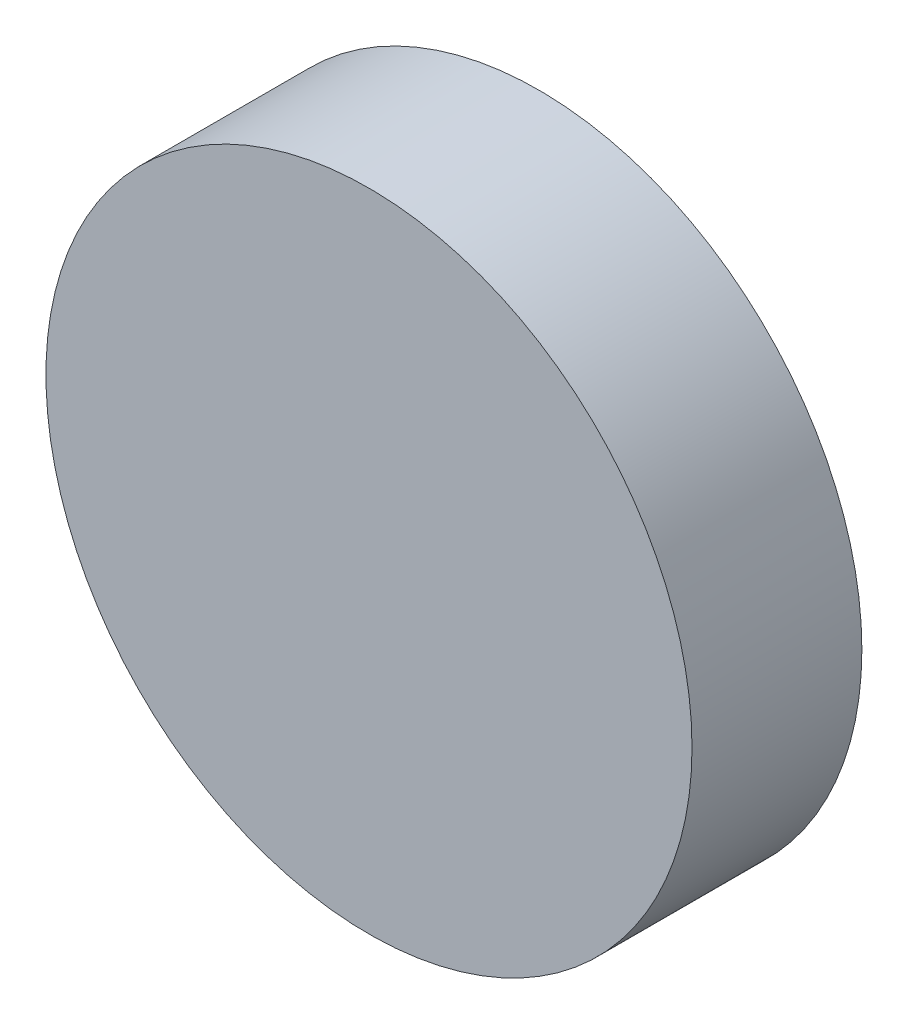
ISO-10303-21;
HEADER;
FILE_DESCRIPTION(('STEP AP214'),'2;1');
FILE_NAME('part.step','',(''),(''),'','','');
FILE_SCHEMA(('AUTOMOTIVE_DESIGN { 1 0 10303 214 1 1 1 1 }'));
ENDSEC;
DATA;
#1=APPLICATION_CONTEXT('core data for automotive mechanical design processes');
#2=APPLICATION_PROTOCOL_DEFINITION('international standard','automotive_design',2000,#1);
#3=PRODUCT_CONTEXT('',#1,'mechanical');
#4=PRODUCT('Part','Part','',(#3));
#5=PRODUCT_RELATED_PRODUCT_CATEGORY('part','',(#4));
#6=PRODUCT_DEFINITION_FORMATION('','',#4);
#7=PRODUCT_DEFINITION_CONTEXT('part definition',#1,'design');
#8=PRODUCT_DEFINITION('design','',#6,#7);
#9=PRODUCT_DEFINITION_SHAPE('','',#8);
#10=(LENGTH_UNIT() NAMED_UNIT(*) SI_UNIT(.MILLI.,.METRE.));
#11=(NAMED_UNIT(*) PLANE_ANGLE_UNIT() SI_UNIT($,.RADIAN.));
#12=(NAMED_UNIT(*) SI_UNIT($,.STERADIAN.) SOLID_ANGLE_UNIT());
#13=UNCERTAINTY_MEASURE_WITH_UNIT(LENGTH_MEASURE(1.E-05),#10,'distance_accuracy_value','');
#14=(GEOMETRIC_REPRESENTATION_CONTEXT(3) GLOBAL_UNCERTAINTY_ASSIGNED_CONTEXT((#13)) GLOBAL_UNIT_ASSIGNED_CONTEXT((#10,
#11,#12)) REPRESENTATION_CONTEXT('',''));
#15=CARTESIAN_POINT('',(0.,0.,0.));
#16=DIRECTION('',(0.,0.,1.));
#17=DIRECTION('',(1.,0.,0.));
#18=AXIS2_PLACEMENT_3D('',#15,#16,#17);
#19=CARTESIAN_POINT('',(0.,0.,10.));
#20=DIRECTION('',(0.,0.,-1.));
#21=DIRECTION('',(-1.,0.,0.));
#22=AXIS2_PLACEMENT_3D('',#19,#20,#21);
#23=CYLINDRICAL_SURFACE('',#22,19.0174339488796);
#24=CARTESIAN_POINT('',(0.,0.,10.));
#25=DIRECTION('',(0.,0.,1.));
#26=DIRECTION('',(1.,0.,0.));
#27=AXIS2_PLACEMENT_3D('',#24,#25,#26);
#28=CIRCLE('',#27,19.0174339488796);
#29=CARTESIAN_POINT('',(19.0174339488796,0.,10.));
#30=VERTEX_POINT('',#29);
#31=EDGE_CURVE('E10',#30,#30,#28,.T.);
#32=ORIENTED_EDGE('',*,*,#31,.F.);
#33=EDGE_LOOP('',(#32));
#34=FACE_BOUND('',#33,.T.);
#35=CARTESIAN_POINT('',(0.,0.,0.));
#36=DIRECTION('',(0.,0.,1.));
#37=DIRECTION('',(1.,0.,0.));
#38=AXIS2_PLACEMENT_3D('',#35,#36,#37);
#39=CIRCLE('',#38,19.0174339488796);
#40=CARTESIAN_POINT('',(19.0174339488796,0.,0.));
#41=VERTEX_POINT('',#40);
#42=EDGE_CURVE('E46',#41,#41,#39,.T.);
#43=ORIENTED_EDGE('',*,*,#42,.T.);
#44=EDGE_LOOP('',(#43));
#45=FACE_BOUND('',#44,.T.);
#46=ADVANCED_FACE('F43',(#34,#45),#23,.T.);
#47=CARTESIAN_POINT('',(0.,0.,10.));
#48=DIRECTION('',(0.,0.,1.));
#49=DIRECTION('',(1.,0.,0.));
#50=AXIS2_PLACEMENT_3D('',#47,#48,#49);
#51=PLANE('',#50);
#52=ORIENTED_EDGE('',*,*,#31,.T.);
#53=EDGE_LOOP('',(#52));
#54=FACE_BOUND('',#53,.T.);
#55=ADVANCED_FACE('F60',(#54),#51,.T.);
#56=CARTESIAN_POINT('',(0.,0.,0.));
#57=DIRECTION('',(0.,0.,1.));
#58=DIRECTION('',(1.,0.,0.));
#59=AXIS2_PLACEMENT_3D('',#56,#57,#58);
#60=PLANE('',#59);
#61=ORIENTED_EDGE('',*,*,#42,.F.);
#62=EDGE_LOOP('',(#61));
#63=FACE_BOUND('',#62,.T.);
#64=ADVANCED_FACE('F58',(#63),#60,.F.);
#65=CLOSED_SHELL('',(#46,#55,#64));
#66=MANIFOLD_SOLID_BREP('B2',#65);
#67=ADVANCED_BREP_SHAPE_REPRESENTATION('',(#18,#66),#14);
#68=SHAPE_DEFINITION_REPRESENTATION(#9,#67);
ENDSEC;
END-ISO-10303-21;
